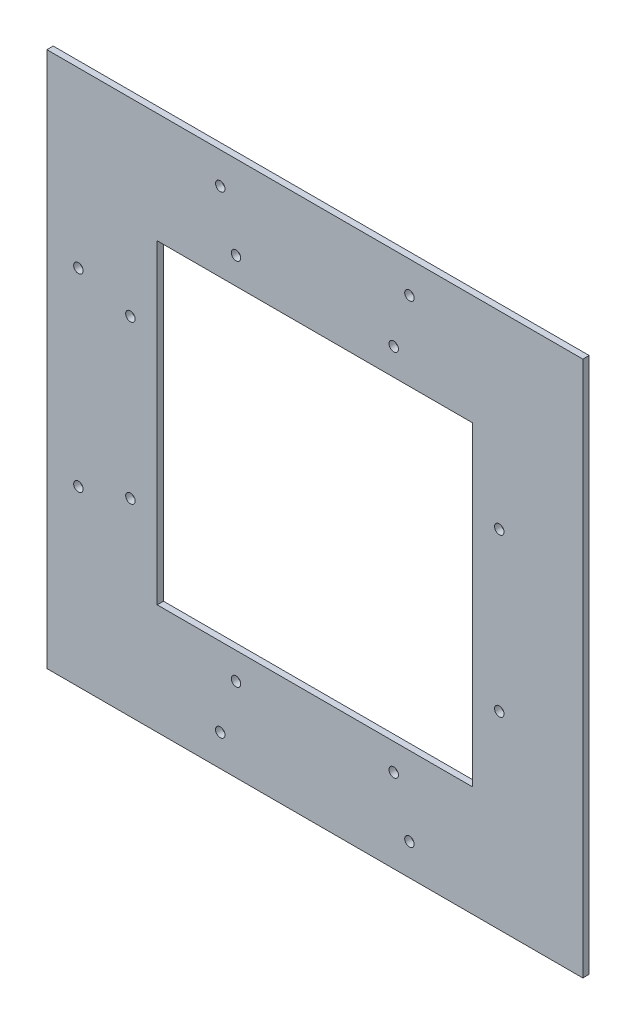
ISO-10303-21;
HEADER;
FILE_DESCRIPTION(('STEP AP214'),'2;1');
FILE_NAME('part.step','',(''),(''),'','','');
FILE_SCHEMA(('AUTOMOTIVE_DESIGN { 1 0 10303 214 1 1 1 1 }'));
ENDSEC;
DATA;
#1=APPLICATION_CONTEXT('core data for automotive mechanical design processes');
#2=APPLICATION_PROTOCOL_DEFINITION('international standard','automotive_design',2000,#1);
#3=PRODUCT_CONTEXT('',#1,'mechanical');
#4=PRODUCT('Part','Part','',(#3));
#5=PRODUCT_RELATED_PRODUCT_CATEGORY('part','',(#4));
#6=PRODUCT_DEFINITION_FORMATION('','',#4);
#7=PRODUCT_DEFINITION_CONTEXT('part definition',#1,'design');
#8=PRODUCT_DEFINITION('design','',#6,#7);
#9=PRODUCT_DEFINITION_SHAPE('','',#8);
#10=(LENGTH_UNIT() NAMED_UNIT(*) SI_UNIT(.MILLI.,.METRE.));
#11=(NAMED_UNIT(*) PLANE_ANGLE_UNIT() SI_UNIT($,.RADIAN.));
#12=(NAMED_UNIT(*) SI_UNIT($,.STERADIAN.) SOLID_ANGLE_UNIT());
#13=UNCERTAINTY_MEASURE_WITH_UNIT(LENGTH_MEASURE(1.E-05),#10,'distance_accuracy_value','');
#14=(GEOMETRIC_REPRESENTATION_CONTEXT(3) GLOBAL_UNCERTAINTY_ASSIGNED_CONTEXT((#13)) GLOBAL_UNIT_ASSIGNED_CONTEXT((#10,
#11,#12)) REPRESENTATION_CONTEXT('',''));
#15=CARTESIAN_POINT('',(0.,0.,0.));
#16=DIRECTION('',(0.,0.,1.));
#17=DIRECTION('',(1.,0.,0.));
#18=AXIS2_PLACEMENT_3D('',#15,#16,#17);
#19=CARTESIAN_POINT('',(85.,85.,2.));
#20=DIRECTION('',(0.,0.,-1.));
#21=DIRECTION('',(-1.,0.,0.));
#22=AXIS2_PLACEMENT_3D('',#19,#20,#21);
#23=PLANE('',#22);
#24=CARTESIAN_POINT('',(30.,75.,2.));
#25=DIRECTION('',(0.,0.,1.));
#26=DIRECTION('',(1.,0.,0.));
#27=AXIS2_PLACEMENT_3D('',#24,#25,#26);
#28=CIRCLE('',#27,1.5);
#29=CARTESIAN_POINT('',(31.5,75.,2.));
#30=VERTEX_POINT('',#29);
#31=EDGE_CURVE('E568',#30,#30,#28,.T.);
#32=ORIENTED_EDGE('',*,*,#31,.F.);
#33=EDGE_LOOP('',(#32));
#34=FACE_BOUND('',#33,.T.);
#35=CARTESIAN_POINT('',(-30.,75.,2.));
#36=DIRECTION('',(0.,0.,1.));
#37=DIRECTION('',(1.,0.,0.));
#38=AXIS2_PLACEMENT_3D('',#35,#36,#37);
#39=CIRCLE('',#38,1.5);
#40=CARTESIAN_POINT('',(-28.5,75.,2.));
#41=VERTEX_POINT('',#40);
#42=EDGE_CURVE('E519',#41,#41,#39,.T.);
#43=ORIENTED_EDGE('',*,*,#42,.F.);
#44=EDGE_LOOP('',(#43));
#45=FACE_BOUND('',#44,.T.);
#46=CARTESIAN_POINT('',(-25.,-58.5,2.));
#47=DIRECTION('',(0.,0.,-1.));
#48=DIRECTION('',(1.,0.,0.));
#49=AXIS2_PLACEMENT_3D('',#46,#47,#48);
#50=CIRCLE('',#49,1.5);
#51=CARTESIAN_POINT('',(-23.5,-58.5,2.));
#52=VERTEX_POINT('',#51);
#53=EDGE_CURVE('E198',#52,#52,#50,.T.);
#54=ORIENTED_EDGE('',*,*,#53,.T.);
#55=EDGE_LOOP('',(#54));
#56=FACE_BOUND('',#55,.T.);
#57=CARTESIAN_POINT('',(25.,58.5,2.));
#58=DIRECTION('',(0.,0.,1.));
#59=DIRECTION('',(1.,0.,0.));
#60=AXIS2_PLACEMENT_3D('',#57,#58,#59);
#61=CIRCLE('',#60,1.5);
#62=CARTESIAN_POINT('',(26.5,58.5,2.));
#63=VERTEX_POINT('',#62);
#64=EDGE_CURVE('E194',#63,#63,#61,.T.);
#65=ORIENTED_EDGE('',*,*,#64,.F.);
#66=EDGE_LOOP('',(#65));
#67=FACE_BOUND('',#66,.T.);
#68=CARTESIAN_POINT('',(-25.,58.5,2.));
#69=DIRECTION('',(0.,0.,1.));
#70=DIRECTION('',(1.,0.,0.));
#71=AXIS2_PLACEMENT_3D('',#68,#69,#70);
#72=CIRCLE('',#71,1.5);
#73=CARTESIAN_POINT('',(-23.5,58.5,2.));
#74=VERTEX_POINT('',#73);
#75=EDGE_CURVE('E190',#74,#74,#72,.T.);
#76=ORIENTED_EDGE('',*,*,#75,.F.);
#77=EDGE_LOOP('',(#76));
#78=FACE_BOUND('',#77,.T.);
#79=CARTESIAN_POINT('',(58.5,-25.,2.));
#80=DIRECTION('',(0.,0.,-1.));
#81=DIRECTION('',(-1.,0.,0.));
#82=AXIS2_PLACEMENT_3D('',#79,#80,#81);
#83=CIRCLE('',#82,1.5);
#84=CARTESIAN_POINT('',(57.,-25.,2.));
#85=VERTEX_POINT('',#84);
#86=EDGE_CURVE('E182',#85,#85,#83,.T.);
#87=ORIENTED_EDGE('',*,*,#86,.T.);
#88=EDGE_LOOP('',(#87));
#89=FACE_BOUND('',#88,.T.);
#90=CARTESIAN_POINT('',(-58.5,25.,2.));
#91=DIRECTION('',(0.,0.,1.));
#92=DIRECTION('',(1.,0.,0.));
#93=AXIS2_PLACEMENT_3D('',#90,#91,#92);
#94=CIRCLE('',#93,1.5);
#95=CARTESIAN_POINT('',(-57.,25.,2.));
#96=VERTEX_POINT('',#95);
#97=EDGE_CURVE('E178',#96,#96,#94,.T.);
#98=ORIENTED_EDGE('',*,*,#97,.F.);
#99=EDGE_LOOP('',(#98));
#100=FACE_BOUND('',#99,.T.);
#101=CARTESIAN_POINT('',(-58.5,-25.,2.));
#102=DIRECTION('',(0.,0.,1.));
#103=DIRECTION('',(1.,0.,0.));
#104=AXIS2_PLACEMENT_3D('',#101,#102,#103);
#105=CIRCLE('',#104,1.5);
#106=CARTESIAN_POINT('',(-57.,-25.,2.));
#107=VERTEX_POINT('',#106);
#108=EDGE_CURVE('E174',#107,#107,#105,.T.);
#109=ORIENTED_EDGE('',*,*,#108,.F.);
#110=EDGE_LOOP('',(#109));
#111=FACE_BOUND('',#110,.T.);
#112=CARTESIAN_POINT('',(-75.,30.,2.));
#113=DIRECTION('',(0.,0.,1.));
#114=DIRECTION('',(1.,0.,0.));
#115=AXIS2_PLACEMENT_3D('',#112,#113,#114);
#116=CIRCLE('',#115,1.5);
#117=CARTESIAN_POINT('',(-73.5,30.,2.));
#118=VERTEX_POINT('',#117);
#119=EDGE_CURVE('E170',#118,#118,#116,.T.);
#120=ORIENTED_EDGE('',*,*,#119,.F.);
#121=EDGE_LOOP('',(#120));
#122=FACE_BOUND('',#121,.T.);
#123=CARTESIAN_POINT('',(-75.,-30.,2.));
#124=DIRECTION('',(0.,0.,1.));
#125=DIRECTION('',(1.,0.,0.));
#126=AXIS2_PLACEMENT_3D('',#123,#124,#125);
#127=CIRCLE('',#126,1.5);
#128=CARTESIAN_POINT('',(-73.5,-30.,2.));
#129=VERTEX_POINT('',#128);
#130=EDGE_CURVE('E166',#129,#129,#127,.T.);
#131=ORIENTED_EDGE('',*,*,#130,.F.);
#132=EDGE_LOOP('',(#131));
#133=FACE_BOUND('',#132,.T.);
#134=DIRECTION('',(-1.,0.,0.));
#135=VECTOR('',#134,1.);
#136=CARTESIAN_POINT('',(-50.,50.,2.));
#137=LINE('',#136,#135);
#138=CARTESIAN_POINT('',(50.,50.,2.));
#139=VERTEX_POINT('',#138);
#140=CARTESIAN_POINT('',(-50.,50.,2.));
#141=VERTEX_POINT('',#140);
#142=EDGE_CURVE('E110',#139,#141,#137,.T.);
#143=ORIENTED_EDGE('',*,*,#142,.F.);
#144=DIRECTION('',(0.,1.,0.));
#145=VECTOR('',#144,1.);
#146=CARTESIAN_POINT('',(50.,-50.,2.));
#147=LINE('',#146,#145);
#148=CARTESIAN_POINT('',(50.,-50.,2.));
#149=VERTEX_POINT('',#148);
#150=EDGE_CURVE('E48',#149,#139,#147,.T.);
#151=ORIENTED_EDGE('',*,*,#150,.F.);
#152=DIRECTION('',(1.,0.,0.));
#153=VECTOR('',#152,1.);
#154=CARTESIAN_POINT('',(-50.,-50.,2.));
#155=LINE('',#154,#153);
#156=CARTESIAN_POINT('',(-50.,-50.,2.));
#157=VERTEX_POINT('',#156);
#158=EDGE_CURVE('E116',#157,#149,#155,.T.);
#159=ORIENTED_EDGE('',*,*,#158,.F.);
#160=DIRECTION('',(0.,-1.,0.));
#161=VECTOR('',#160,1.);
#162=CARTESIAN_POINT('',(-50.,-50.,2.));
#163=LINE('',#162,#161);
#164=EDGE_CURVE('E101',#141,#157,#163,.T.);
#165=ORIENTED_EDGE('',*,*,#164,.F.);
#166=EDGE_LOOP('',(#143,#151,#159,#165));
#167=FACE_BOUND('',#166,.T.);
#168=DIRECTION('',(0.,1.,0.));
#169=VECTOR('',#168,1.);
#170=CARTESIAN_POINT('',(85.,-85.,2.));
#171=LINE('',#170,#169);
#172=CARTESIAN_POINT('',(85.,-85.,2.));
#173=VERTEX_POINT('',#172);
#174=CARTESIAN_POINT('',(85.,85.,2.));
#175=VERTEX_POINT('',#174);
#176=EDGE_CURVE('E126',#173,#175,#171,.T.);
#177=ORIENTED_EDGE('',*,*,#176,.T.);
#178=DIRECTION('',(-1.,0.,0.));
#179=VECTOR('',#178,1.);
#180=CARTESIAN_POINT('',(-85.,85.,2.));
#181=LINE('',#180,#179);
#182=CARTESIAN_POINT('',(-85.,85.,2.));
#183=VERTEX_POINT('',#182);
#184=EDGE_CURVE('E129',#175,#183,#181,.T.);
#185=ORIENTED_EDGE('',*,*,#184,.T.);
#186=DIRECTION('',(0.,-1.,0.));
#187=VECTOR('',#186,1.);
#188=CARTESIAN_POINT('',(-85.,-85.,2.));
#189=LINE('',#188,#187);
#190=CARTESIAN_POINT('',(-85.,-85.,2.));
#191=VERTEX_POINT('',#190);
#192=EDGE_CURVE('E132',#183,#191,#189,.T.);
#193=ORIENTED_EDGE('',*,*,#192,.T.);
#194=DIRECTION('',(1.,0.,0.));
#195=VECTOR('',#194,1.);
#196=CARTESIAN_POINT('',(-85.,-85.,2.));
#197=LINE('',#196,#195);
#198=EDGE_CURVE('E134',#191,#173,#197,.T.);
#199=ORIENTED_EDGE('',*,*,#198,.T.);
#200=EDGE_LOOP('',(#177,#185,#193,#199));
#201=FACE_BOUND('',#200,.T.);
#202=CARTESIAN_POINT('',(58.5,25.,2.));
#203=DIRECTION('',(0.,0.,-1.));
#204=DIRECTION('',(-1.,0.,0.));
#205=AXIS2_PLACEMENT_3D('',#202,#203,#204);
#206=CIRCLE('',#205,1.5);
#207=CARTESIAN_POINT('',(57.,25.,2.));
#208=VERTEX_POINT('',#207);
#209=EDGE_CURVE('E186',#208,#208,#206,.T.);
#210=ORIENTED_EDGE('',*,*,#209,.T.);
#211=EDGE_LOOP('',(#210));
#212=FACE_BOUND('',#211,.T.);
#213=CARTESIAN_POINT('',(25.,-58.5,2.));
#214=DIRECTION('',(0.,0.,-1.));
#215=DIRECTION('',(1.,0.,0.));
#216=AXIS2_PLACEMENT_3D('',#213,#214,#215);
#217=CIRCLE('',#216,1.5);
#218=CARTESIAN_POINT('',(26.5,-58.5,2.));
#219=VERTEX_POINT('',#218);
#220=EDGE_CURVE('E202',#219,#219,#217,.T.);
#221=ORIENTED_EDGE('',*,*,#220,.T.);
#222=EDGE_LOOP('',(#221));
#223=FACE_BOUND('',#222,.T.);
#224=CARTESIAN_POINT('',(-30.,-75.,2.));
#225=DIRECTION('',(0.,0.,1.));
#226=DIRECTION('',(1.,0.,0.));
#227=AXIS2_PLACEMENT_3D('',#224,#225,#226);
#228=CIRCLE('',#227,1.5);
#229=CARTESIAN_POINT('',(-28.5,-75.,2.));
#230=VERTEX_POINT('',#229);
#231=EDGE_CURVE('E205',#230,#230,#228,.T.);
#232=ORIENTED_EDGE('',*,*,#231,.F.);
#233=EDGE_LOOP('',(#232));
#234=FACE_BOUND('',#233,.T.);
#235=CARTESIAN_POINT('',(30.,-75.,2.));
#236=DIRECTION('',(0.,0.,1.));
#237=DIRECTION('',(1.,0.,0.));
#238=AXIS2_PLACEMENT_3D('',#235,#236,#237);
#239=CIRCLE('',#238,1.5);
#240=CARTESIAN_POINT('',(31.5,-75.,2.));
#241=VERTEX_POINT('',#240);
#242=EDGE_CURVE('E11',#241,#241,#239,.T.);
#243=ORIENTED_EDGE('',*,*,#242,.F.);
#244=EDGE_LOOP('',(#243));
#245=FACE_BOUND('',#244,.T.);
#246=ADVANCED_FACE('F33',(#34,#45,#56,#67,#78,#89,#100,#111,#122,#133,#167,#201,#212,#223,#234,
#245),#23,.F.);
#247=CARTESIAN_POINT('',(85.,85.,0.));
#248=DIRECTION('',(0.,0.,-1.));
#249=DIRECTION('',(-1.,0.,0.));
#250=AXIS2_PLACEMENT_3D('',#247,#248,#249);
#251=PLANE('',#250);
#252=CARTESIAN_POINT('',(30.,75.,0.));
#253=DIRECTION('',(0.,0.,1.));
#254=DIRECTION('',(1.,0.,0.));
#255=AXIS2_PLACEMENT_3D('',#252,#253,#254);
#256=CIRCLE('',#255,1.5);
#257=CARTESIAN_POINT('',(31.5,75.,0.));
#258=VERTEX_POINT('',#257);
#259=EDGE_CURVE('E572',#258,#258,#256,.T.);
#260=ORIENTED_EDGE('',*,*,#259,.T.);
#261=EDGE_LOOP('',(#260));
#262=FACE_BOUND('',#261,.T.);
#263=CARTESIAN_POINT('',(-30.,75.,0.));
#264=DIRECTION('',(0.,0.,1.));
#265=DIRECTION('',(1.,0.,0.));
#266=AXIS2_PLACEMENT_3D('',#263,#264,#265);
#267=CIRCLE('',#266,1.5);
#268=CARTESIAN_POINT('',(-28.5,75.,0.));
#269=VERTEX_POINT('',#268);
#270=EDGE_CURVE('E516',#269,#269,#267,.T.);
#271=ORIENTED_EDGE('',*,*,#270,.T.);
#272=EDGE_LOOP('',(#271));
#273=FACE_BOUND('',#272,.T.);
#274=CARTESIAN_POINT('',(-25.,-58.5,0.));
#275=DIRECTION('',(0.,0.,-1.));
#276=DIRECTION('',(-1.,0.,0.));
#277=AXIS2_PLACEMENT_3D('',#274,#275,#276);
#278=CIRCLE('',#277,1.5);
#279=CARTESIAN_POINT('',(-26.5,-58.5,0.));
#280=VERTEX_POINT('',#279);
#281=EDGE_CURVE('E195',#280,#280,#278,.F.);
#282=ORIENTED_EDGE('',*,*,#281,.T.);
#283=EDGE_LOOP('',(#282));
#284=FACE_BOUND('',#283,.T.);
#285=CARTESIAN_POINT('',(25.,58.5,0.));
#286=DIRECTION('',(0.,0.,-1.));
#287=DIRECTION('',(-1.,0.,0.));
#288=AXIS2_PLACEMENT_3D('',#285,#286,#287);
#289=CIRCLE('',#288,1.5);
#290=CARTESIAN_POINT('',(23.5,58.5,0.));
#291=VERTEX_POINT('',#290);
#292=EDGE_CURVE('E191',#291,#291,#289,.T.);
#293=ORIENTED_EDGE('',*,*,#292,.F.);
#294=EDGE_LOOP('',(#293));
#295=FACE_BOUND('',#294,.T.);
#296=CARTESIAN_POINT('',(-25.,58.5,0.));
#297=DIRECTION('',(0.,0.,-1.));
#298=DIRECTION('',(-1.,0.,0.));
#299=AXIS2_PLACEMENT_3D('',#296,#297,#298);
#300=CIRCLE('',#299,1.5);
#301=CARTESIAN_POINT('',(-26.5,58.5,0.));
#302=VERTEX_POINT('',#301);
#303=EDGE_CURVE('E187',#302,#302,#300,.T.);
#304=ORIENTED_EDGE('',*,*,#303,.F.);
#305=EDGE_LOOP('',(#304));
#306=FACE_BOUND('',#305,.T.);
#307=CARTESIAN_POINT('',(58.5,-25.,0.));
#308=DIRECTION('',(0.,0.,-1.));
#309=DIRECTION('',(-1.,0.,0.));
#310=AXIS2_PLACEMENT_3D('',#307,#308,#309);
#311=CIRCLE('',#310,1.5);
#312=CARTESIAN_POINT('',(57.,-25.,0.));
#313=VERTEX_POINT('',#312);
#314=EDGE_CURVE('E179',#313,#313,#311,.F.);
#315=ORIENTED_EDGE('',*,*,#314,.T.);
#316=EDGE_LOOP('',(#315));
#317=FACE_BOUND('',#316,.T.);
#318=CARTESIAN_POINT('',(-58.5,25.,0.));
#319=DIRECTION('',(0.,0.,-1.));
#320=DIRECTION('',(-1.,0.,0.));
#321=AXIS2_PLACEMENT_3D('',#318,#319,#320);
#322=CIRCLE('',#321,1.5);
#323=CARTESIAN_POINT('',(-60.,25.,0.));
#324=VERTEX_POINT('',#323);
#325=EDGE_CURVE('E175',#324,#324,#322,.T.);
#326=ORIENTED_EDGE('',*,*,#325,.F.);
#327=EDGE_LOOP('',(#326));
#328=FACE_BOUND('',#327,.T.);
#329=CARTESIAN_POINT('',(-58.5,-25.,0.));
#330=DIRECTION('',(0.,0.,-1.));
#331=DIRECTION('',(-1.,0.,0.));
#332=AXIS2_PLACEMENT_3D('',#329,#330,#331);
#333=CIRCLE('',#332,1.5);
#334=CARTESIAN_POINT('',(-60.,-25.,0.));
#335=VERTEX_POINT('',#334);
#336=EDGE_CURVE('E171',#335,#335,#333,.T.);
#337=ORIENTED_EDGE('',*,*,#336,.F.);
#338=EDGE_LOOP('',(#337));
#339=FACE_BOUND('',#338,.T.);
#340=CARTESIAN_POINT('',(-75.,30.,0.));
#341=DIRECTION('',(0.,0.,-1.));
#342=DIRECTION('',(-1.,0.,0.));
#343=AXIS2_PLACEMENT_3D('',#340,#341,#342);
#344=CIRCLE('',#343,1.5);
#345=CARTESIAN_POINT('',(-76.5,30.,0.));
#346=VERTEX_POINT('',#345);
#347=EDGE_CURVE('E167',#346,#346,#344,.T.);
#348=ORIENTED_EDGE('',*,*,#347,.F.);
#349=EDGE_LOOP('',(#348));
#350=FACE_BOUND('',#349,.T.);
#351=CARTESIAN_POINT('',(-75.,-30.,0.));
#352=DIRECTION('',(0.,0.,-1.));
#353=DIRECTION('',(-1.,0.,0.));
#354=AXIS2_PLACEMENT_3D('',#351,#352,#353);
#355=CIRCLE('',#354,1.5);
#356=CARTESIAN_POINT('',(-76.5,-30.,0.));
#357=VERTEX_POINT('',#356);
#358=EDGE_CURVE('E163',#357,#357,#355,.T.);
#359=ORIENTED_EDGE('',*,*,#358,.F.);
#360=EDGE_LOOP('',(#359));
#361=FACE_BOUND('',#360,.T.);
#362=DIRECTION('',(0.,-1.,0.));
#363=VECTOR('',#362,1.);
#364=CARTESIAN_POINT('',(50.,85.,0.));
#365=LINE('',#364,#363);
#366=CARTESIAN_POINT('',(50.,50.,0.));
#367=VERTEX_POINT('',#366);
#368=CARTESIAN_POINT('',(50.,-50.,0.));
#369=VERTEX_POINT('',#368);
#370=EDGE_CURVE('E160',#367,#369,#365,.T.);
#371=ORIENTED_EDGE('',*,*,#370,.F.);
#372=DIRECTION('',(1.,0.,0.));
#373=VECTOR('',#372,1.);
#374=CARTESIAN_POINT('',(85.,50.,0.));
#375=LINE('',#374,#373);
#376=CARTESIAN_POINT('',(-50.,50.,0.));
#377=VERTEX_POINT('',#376);
#378=EDGE_CURVE('E155',#377,#367,#375,.T.);
#379=ORIENTED_EDGE('',*,*,#378,.F.);
#380=DIRECTION('',(0.,1.,0.));
#381=VECTOR('',#380,1.);
#382=CARTESIAN_POINT('',(-50.,85.,0.));
#383=LINE('',#382,#381);
#384=CARTESIAN_POINT('',(-50.,-50.,0.));
#385=VERTEX_POINT('',#384);
#386=EDGE_CURVE('E104',#385,#377,#383,.T.);
#387=ORIENTED_EDGE('',*,*,#386,.F.);
#388=DIRECTION('',(-1.,0.,0.));
#389=VECTOR('',#388,1.);
#390=CARTESIAN_POINT('',(85.,-50.,0.));
#391=LINE('',#390,#389);
#392=EDGE_CURVE('E158',#369,#385,#391,.T.);
#393=ORIENTED_EDGE('',*,*,#392,.F.);
#394=EDGE_LOOP('',(#371,#379,#387,#393));
#395=FACE_BOUND('',#394,.T.);
#396=DIRECTION('',(0.,1.,0.));
#397=VECTOR('',#396,1.);
#398=CARTESIAN_POINT('',(85.,-85.,0.));
#399=LINE('',#398,#397);
#400=CARTESIAN_POINT('',(85.,-85.,0.));
#401=VERTEX_POINT('',#400);
#402=CARTESIAN_POINT('',(85.,85.,0.));
#403=VERTEX_POINT('',#402);
#404=EDGE_CURVE('E123',#401,#403,#399,.T.);
#405=ORIENTED_EDGE('',*,*,#404,.F.);
#406=DIRECTION('',(1.,0.,0.));
#407=VECTOR('',#406,1.);
#408=CARTESIAN_POINT('',(-85.,-85.,0.));
#409=LINE('',#408,#407);
#410=CARTESIAN_POINT('',(-85.,-85.,0.));
#411=VERTEX_POINT('',#410);
#412=EDGE_CURVE('E130',#411,#401,#409,.T.);
#413=ORIENTED_EDGE('',*,*,#412,.F.);
#414=DIRECTION('',(0.,-1.,0.));
#415=VECTOR('',#414,1.);
#416=CARTESIAN_POINT('',(-85.,-85.,0.));
#417=LINE('',#416,#415);
#418=CARTESIAN_POINT('',(-85.,85.,0.));
#419=VERTEX_POINT('',#418);
#420=EDGE_CURVE('E141',#419,#411,#417,.T.);
#421=ORIENTED_EDGE('',*,*,#420,.F.);
#422=DIRECTION('',(-1.,0.,0.));
#423=VECTOR('',#422,1.);
#424=CARTESIAN_POINT('',(-85.,85.,0.));
#425=LINE('',#424,#423);
#426=EDGE_CURVE('E139',#403,#419,#425,.T.);
#427=ORIENTED_EDGE('',*,*,#426,.F.);
#428=EDGE_LOOP('',(#405,#413,#421,#427));
#429=FACE_BOUND('',#428,.T.);
#430=CARTESIAN_POINT('',(58.5,25.,0.));
#431=DIRECTION('',(0.,0.,-1.));
#432=DIRECTION('',(-1.,0.,0.));
#433=AXIS2_PLACEMENT_3D('',#430,#431,#432);
#434=CIRCLE('',#433,1.5);
#435=CARTESIAN_POINT('',(57.,25.,0.));
#436=VERTEX_POINT('',#435);
#437=EDGE_CURVE('E183',#436,#436,#434,.F.);
#438=ORIENTED_EDGE('',*,*,#437,.T.);
#439=EDGE_LOOP('',(#438));
#440=FACE_BOUND('',#439,.T.);
#441=CARTESIAN_POINT('',(25.,-58.5,0.));
#442=DIRECTION('',(0.,0.,-1.));
#443=DIRECTION('',(-1.,0.,0.));
#444=AXIS2_PLACEMENT_3D('',#441,#442,#443);
#445=CIRCLE('',#444,1.5);
#446=CARTESIAN_POINT('',(23.5,-58.5,0.));
#447=VERTEX_POINT('',#446);
#448=EDGE_CURVE('E199',#447,#447,#445,.F.);
#449=ORIENTED_EDGE('',*,*,#448,.T.);
#450=EDGE_LOOP('',(#449));
#451=FACE_BOUND('',#450,.T.);
#452=CARTESIAN_POINT('',(-30.,-75.,0.));
#453=DIRECTION('',(0.,0.,1.));
#454=DIRECTION('',(1.,0.,0.));
#455=AXIS2_PLACEMENT_3D('',#452,#453,#454);
#456=CIRCLE('',#455,1.5);
#457=CARTESIAN_POINT('',(-28.5,-75.,0.));
#458=VERTEX_POINT('',#457);
#459=EDGE_CURVE('E162',#458,#458,#456,.T.);
#460=ORIENTED_EDGE('',*,*,#459,.T.);
#461=EDGE_LOOP('',(#460));
#462=FACE_BOUND('',#461,.T.);
#463=CARTESIAN_POINT('',(30.,-75.,0.));
#464=DIRECTION('',(0.,0.,1.));
#465=DIRECTION('',(1.,0.,0.));
#466=AXIS2_PLACEMENT_3D('',#463,#464,#465);
#467=CIRCLE('',#466,1.5);
#468=CARTESIAN_POINT('',(31.5,-75.,0.));
#469=VERTEX_POINT('',#468);
#470=EDGE_CURVE('E41',#469,#469,#467,.T.);
#471=ORIENTED_EDGE('',*,*,#470,.T.);
#472=EDGE_LOOP('',(#471));
#473=FACE_BOUND('',#472,.T.);
#474=ADVANCED_FACE('F210',(#262,#273,#284,#295,#306,#317,#328,#339,#350,#361,#395,#429,#440,
#451,#462,#473),#251,.T.);
#475=CARTESIAN_POINT('',(85.,-85.,2.));
#476=DIRECTION('',(-1.,0.,0.));
#477=DIRECTION('',(0.,0.,1.));
#478=AXIS2_PLACEMENT_3D('',#475,#476,#477);
#479=PLANE('',#478);
#480=ORIENTED_EDGE('',*,*,#404,.T.);
#481=DIRECTION('',(0.,0.,-1.));
#482=VECTOR('',#481,1.);
#483=CARTESIAN_POINT('',(85.,85.,2.));
#484=LINE('',#483,#482);
#485=EDGE_CURVE('E152',#175,#403,#484,.T.);
#486=ORIENTED_EDGE('',*,*,#485,.F.);
#487=ORIENTED_EDGE('',*,*,#176,.F.);
#488=DIRECTION('',(0.,0.,-1.));
#489=VECTOR('',#488,1.);
#490=CARTESIAN_POINT('',(85.,-85.,2.));
#491=LINE('',#490,#489);
#492=EDGE_CURVE('E136',#173,#401,#491,.T.);
#493=ORIENTED_EDGE('',*,*,#492,.T.);
#494=EDGE_LOOP('',(#480,#486,#487,#493));
#495=FACE_BOUND('',#494,.T.);
#496=ADVANCED_FACE('F223',(#495),#479,.F.);
#497=CARTESIAN_POINT('',(-85.,85.,2.));
#498=DIRECTION('',(0.,-1.,0.));
#499=DIRECTION('',(0.,0.,-1.));
#500=AXIS2_PLACEMENT_3D('',#497,#498,#499);
#501=PLANE('',#500);
#502=ORIENTED_EDGE('',*,*,#426,.T.);
#503=DIRECTION('',(0.,0.,-1.));
#504=VECTOR('',#503,1.);
#505=CARTESIAN_POINT('',(-85.,85.,2.));
#506=LINE('',#505,#504);
#507=EDGE_CURVE('E149',#183,#419,#506,.T.);
#508=ORIENTED_EDGE('',*,*,#507,.F.);
#509=ORIENTED_EDGE('',*,*,#184,.F.);
#510=ORIENTED_EDGE('',*,*,#485,.T.);
#511=EDGE_LOOP('',(#502,#508,#509,#510));
#512=FACE_BOUND('',#511,.T.);
#513=ADVANCED_FACE('F239',(#512),#501,.F.);
#514=CARTESIAN_POINT('',(-85.,-85.,2.));
#515=DIRECTION('',(1.,0.,0.));
#516=DIRECTION('',(0.,0.,-1.));
#517=AXIS2_PLACEMENT_3D('',#514,#515,#516);
#518=PLANE('',#517);
#519=ORIENTED_EDGE('',*,*,#420,.T.);
#520=DIRECTION('',(0.,0.,-1.));
#521=VECTOR('',#520,1.);
#522=CARTESIAN_POINT('',(-85.,-85.,2.));
#523=LINE('',#522,#521);
#524=EDGE_CURVE('E146',#191,#411,#523,.T.);
#525=ORIENTED_EDGE('',*,*,#524,.F.);
#526=ORIENTED_EDGE('',*,*,#192,.F.);
#527=ORIENTED_EDGE('',*,*,#507,.T.);
#528=EDGE_LOOP('',(#519,#525,#526,#527));
#529=FACE_BOUND('',#528,.T.);
#530=ADVANCED_FACE('F235',(#529),#518,.F.);
#531=CARTESIAN_POINT('',(-85.,-85.,2.));
#532=DIRECTION('',(0.,1.,0.));
#533=DIRECTION('',(0.,0.,1.));
#534=AXIS2_PLACEMENT_3D('',#531,#532,#533);
#535=PLANE('',#534);
#536=ORIENTED_EDGE('',*,*,#412,.T.);
#537=ORIENTED_EDGE('',*,*,#492,.F.);
#538=ORIENTED_EDGE('',*,*,#198,.F.);
#539=ORIENTED_EDGE('',*,*,#524,.T.);
#540=EDGE_LOOP('',(#536,#537,#538,#539));
#541=FACE_BOUND('',#540,.T.);
#542=ADVANCED_FACE('F232',(#541),#535,.F.);
#543=CARTESIAN_POINT('',(50.,-50.,-8.));
#544=DIRECTION('',(1.,0.,0.));
#545=DIRECTION('',(0.,0.,-1.));
#546=AXIS2_PLACEMENT_3D('',#543,#544,#545);
#547=PLANE('',#546);
#548=ORIENTED_EDGE('',*,*,#370,.T.);
#549=DIRECTION('',(0.,0.,1.));
#550=VECTOR('',#549,1.);
#551=CARTESIAN_POINT('',(50.,-50.,-8.));
#552=LINE('',#551,#550);
#553=EDGE_CURVE('E121',#369,#149,#552,.T.);
#554=ORIENTED_EDGE('',*,*,#553,.T.);
#555=ORIENTED_EDGE('',*,*,#150,.T.);
#556=DIRECTION('',(0.,0.,1.));
#557=VECTOR('',#556,1.);
#558=CARTESIAN_POINT('',(50.,50.,-8.));
#559=LINE('',#558,#557);
#560=EDGE_CURVE('E107',#367,#139,#559,.T.);
#561=ORIENTED_EDGE('',*,*,#560,.F.);
#562=EDGE_LOOP('',(#548,#554,#555,#561));
#563=FACE_BOUND('',#562,.T.);
#564=ADVANCED_FACE('F229',(#563),#547,.F.);
#565=CARTESIAN_POINT('',(-50.,-50.,-8.));
#566=DIRECTION('',(0.,-1.,0.));
#567=DIRECTION('',(0.,0.,-1.));
#568=AXIS2_PLACEMENT_3D('',#565,#566,#567);
#569=PLANE('',#568);
#570=ORIENTED_EDGE('',*,*,#392,.T.);
#571=DIRECTION('',(0.,0.,1.));
#572=VECTOR('',#571,1.);
#573=CARTESIAN_POINT('',(-50.,-50.,-8.));
#574=LINE('',#573,#572);
#575=EDGE_CURVE('E106',#385,#157,#574,.T.);
#576=ORIENTED_EDGE('',*,*,#575,.T.);
#577=ORIENTED_EDGE('',*,*,#158,.T.);
#578=ORIENTED_EDGE('',*,*,#553,.F.);
#579=EDGE_LOOP('',(#570,#576,#577,#578));
#580=FACE_BOUND('',#579,.T.);
#581=ADVANCED_FACE('F308',(#580),#569,.F.);
#582=CARTESIAN_POINT('',(-50.,-50.,-8.));
#583=DIRECTION('',(-1.,0.,0.));
#584=DIRECTION('',(0.,0.,1.));
#585=AXIS2_PLACEMENT_3D('',#582,#583,#584);
#586=PLANE('',#585);
#587=ORIENTED_EDGE('',*,*,#386,.T.);
#588=DIRECTION('',(0.,0.,1.));
#589=VECTOR('',#588,1.);
#590=CARTESIAN_POINT('',(-50.,50.,-8.));
#591=LINE('',#590,#589);
#592=EDGE_CURVE('E56',#377,#141,#591,.T.);
#593=ORIENTED_EDGE('',*,*,#592,.T.);
#594=ORIENTED_EDGE('',*,*,#164,.T.);
#595=ORIENTED_EDGE('',*,*,#575,.F.);
#596=EDGE_LOOP('',(#587,#593,#594,#595));
#597=FACE_BOUND('',#596,.T.);
#598=ADVANCED_FACE('F98',(#597),#586,.F.);
#599=CARTESIAN_POINT('',(-50.,50.,-8.));
#600=DIRECTION('',(0.,1.,0.));
#601=DIRECTION('',(0.,0.,1.));
#602=AXIS2_PLACEMENT_3D('',#599,#600,#601);
#603=PLANE('',#602);
#604=ORIENTED_EDGE('',*,*,#378,.T.);
#605=ORIENTED_EDGE('',*,*,#560,.T.);
#606=ORIENTED_EDGE('',*,*,#142,.T.);
#607=ORIENTED_EDGE('',*,*,#592,.F.);
#608=EDGE_LOOP('',(#604,#605,#606,#607));
#609=FACE_BOUND('',#608,.T.);
#610=ADVANCED_FACE('F111',(#609),#603,.F.);
#611=CARTESIAN_POINT('',(-75.,-30.,-118.));
#612=DIRECTION('',(0.,0.,1.));
#613=DIRECTION('',(1.,0.,0.));
#614=AXIS2_PLACEMENT_3D('',#611,#612,#613);
#615=CYLINDRICAL_SURFACE('',#614,1.5);
#616=ORIENTED_EDGE('',*,*,#358,.T.);
#617=EDGE_LOOP('',(#616));
#618=FACE_BOUND('',#617,.T.);
#619=ORIENTED_EDGE('',*,*,#130,.T.);
#620=EDGE_LOOP('',(#619));
#621=FACE_BOUND('',#620,.T.);
#622=ADVANCED_FACE('F303',(#618,#621),#615,.F.);
#623=CARTESIAN_POINT('',(-75.,30.,-118.));
#624=DIRECTION('',(0.,0.,1.));
#625=DIRECTION('',(1.,0.,0.));
#626=AXIS2_PLACEMENT_3D('',#623,#624,#625);
#627=CYLINDRICAL_SURFACE('',#626,1.5);
#628=ORIENTED_EDGE('',*,*,#347,.T.);
#629=EDGE_LOOP('',(#628));
#630=FACE_BOUND('',#629,.T.);
#631=ORIENTED_EDGE('',*,*,#119,.T.);
#632=EDGE_LOOP('',(#631));
#633=FACE_BOUND('',#632,.T.);
#634=ADVANCED_FACE('F299',(#630,#633),#627,.F.);
#635=CARTESIAN_POINT('',(-58.5,-25.,-118.));
#636=DIRECTION('',(0.,0.,1.));
#637=DIRECTION('',(1.,0.,0.));
#638=AXIS2_PLACEMENT_3D('',#635,#636,#637);
#639=CYLINDRICAL_SURFACE('',#638,1.5);
#640=ORIENTED_EDGE('',*,*,#336,.T.);
#641=EDGE_LOOP('',(#640));
#642=FACE_BOUND('',#641,.T.);
#643=ORIENTED_EDGE('',*,*,#108,.T.);
#644=EDGE_LOOP('',(#643));
#645=FACE_BOUND('',#644,.T.);
#646=ADVANCED_FACE('F295',(#642,#645),#639,.F.);
#647=CARTESIAN_POINT('',(-58.5,25.,-118.));
#648=DIRECTION('',(0.,0.,1.));
#649=DIRECTION('',(1.,0.,0.));
#650=AXIS2_PLACEMENT_3D('',#647,#648,#649);
#651=CYLINDRICAL_SURFACE('',#650,1.5);
#652=ORIENTED_EDGE('',*,*,#325,.T.);
#653=EDGE_LOOP('',(#652));
#654=FACE_BOUND('',#653,.T.);
#655=ORIENTED_EDGE('',*,*,#97,.T.);
#656=EDGE_LOOP('',(#655));
#657=FACE_BOUND('',#656,.T.);
#658=ADVANCED_FACE('F291',(#654,#657),#651,.F.);
#659=CARTESIAN_POINT('',(58.5,-25.,-118.));
#660=DIRECTION('',(0.,0.,1.));
#661=DIRECTION('',(1.,0.,0.));
#662=AXIS2_PLACEMENT_3D('',#659,#660,#661);
#663=CYLINDRICAL_SURFACE('',#662,1.5);
#664=ORIENTED_EDGE('',*,*,#314,.F.);
#665=EDGE_LOOP('',(#664));
#666=FACE_BOUND('',#665,.T.);
#667=ORIENTED_EDGE('',*,*,#86,.F.);
#668=EDGE_LOOP('',(#667));
#669=FACE_BOUND('',#668,.T.);
#670=ADVANCED_FACE('F287',(#666,#669),#663,.F.);
#671=CARTESIAN_POINT('',(58.5,25.,-118.));
#672=DIRECTION('',(0.,0.,1.));
#673=DIRECTION('',(1.,0.,0.));
#674=AXIS2_PLACEMENT_3D('',#671,#672,#673);
#675=CYLINDRICAL_SURFACE('',#674,1.5);
#676=ORIENTED_EDGE('',*,*,#437,.F.);
#677=EDGE_LOOP('',(#676));
#678=FACE_BOUND('',#677,.T.);
#679=ORIENTED_EDGE('',*,*,#209,.F.);
#680=EDGE_LOOP('',(#679));
#681=FACE_BOUND('',#680,.T.);
#682=ADVANCED_FACE('F283',(#678,#681),#675,.F.);
#683=CARTESIAN_POINT('',(-25.,58.5,-118.));
#684=DIRECTION('',(0.,0.,1.));
#685=DIRECTION('',(1.,0.,0.));
#686=AXIS2_PLACEMENT_3D('',#683,#684,#685);
#687=CYLINDRICAL_SURFACE('',#686,1.5);
#688=ORIENTED_EDGE('',*,*,#303,.T.);
#689=EDGE_LOOP('',(#688));
#690=FACE_BOUND('',#689,.T.);
#691=ORIENTED_EDGE('',*,*,#75,.T.);
#692=EDGE_LOOP('',(#691));
#693=FACE_BOUND('',#692,.T.);
#694=ADVANCED_FACE('F279',(#690,#693),#687,.F.);
#695=CARTESIAN_POINT('',(25.,58.5,-118.));
#696=DIRECTION('',(0.,0.,1.));
#697=DIRECTION('',(1.,0.,0.));
#698=AXIS2_PLACEMENT_3D('',#695,#696,#697);
#699=CYLINDRICAL_SURFACE('',#698,1.5);
#700=ORIENTED_EDGE('',*,*,#292,.T.);
#701=EDGE_LOOP('',(#700));
#702=FACE_BOUND('',#701,.T.);
#703=ORIENTED_EDGE('',*,*,#64,.T.);
#704=EDGE_LOOP('',(#703));
#705=FACE_BOUND('',#704,.T.);
#706=ADVANCED_FACE('F275',(#702,#705),#699,.F.);
#707=CARTESIAN_POINT('',(-25.,-58.5,-118.));
#708=DIRECTION('',(0.,0.,1.));
#709=DIRECTION('',(1.,0.,0.));
#710=AXIS2_PLACEMENT_3D('',#707,#708,#709);
#711=CYLINDRICAL_SURFACE('',#710,1.5);
#712=ORIENTED_EDGE('',*,*,#281,.F.);
#713=EDGE_LOOP('',(#712));
#714=FACE_BOUND('',#713,.T.);
#715=ORIENTED_EDGE('',*,*,#53,.F.);
#716=EDGE_LOOP('',(#715));
#717=FACE_BOUND('',#716,.T.);
#718=ADVANCED_FACE('F271',(#714,#717),#711,.F.);
#719=CARTESIAN_POINT('',(25.,-58.5,-118.));
#720=DIRECTION('',(0.,0.,1.));
#721=DIRECTION('',(1.,0.,0.));
#722=AXIS2_PLACEMENT_3D('',#719,#720,#721);
#723=CYLINDRICAL_SURFACE('',#722,1.5);
#724=ORIENTED_EDGE('',*,*,#448,.F.);
#725=EDGE_LOOP('',(#724));
#726=FACE_BOUND('',#725,.T.);
#727=ORIENTED_EDGE('',*,*,#220,.F.);
#728=EDGE_LOOP('',(#727));
#729=FACE_BOUND('',#728,.T.);
#730=ADVANCED_FACE('F263',(#726,#729),#723,.F.);
#731=CARTESIAN_POINT('',(-30.,75.,0.));
#732=DIRECTION('',(0.,0.,1.));
#733=DIRECTION('',(1.,0.,0.));
#734=AXIS2_PLACEMENT_3D('',#731,#732,#733);
#735=CYLINDRICAL_SURFACE('',#734,1.5);
#736=ORIENTED_EDGE('',*,*,#270,.F.);
#737=EDGE_LOOP('',(#736));
#738=FACE_BOUND('',#737,.T.);
#739=ORIENTED_EDGE('',*,*,#42,.T.);
#740=EDGE_LOOP('',(#739));
#741=FACE_BOUND('',#740,.T.);
#742=ADVANCED_FACE('F252',(#738,#741),#735,.F.);
#743=CARTESIAN_POINT('',(30.,75.,0.));
#744=DIRECTION('',(0.,0.,1.));
#745=DIRECTION('',(1.,0.,0.));
#746=AXIS2_PLACEMENT_3D('',#743,#744,#745);
#747=CYLINDRICAL_SURFACE('',#746,1.5);
#748=ORIENTED_EDGE('',*,*,#259,.F.);
#749=EDGE_LOOP('',(#748));
#750=FACE_BOUND('',#749,.T.);
#751=ORIENTED_EDGE('',*,*,#31,.T.);
#752=EDGE_LOOP('',(#751));
#753=FACE_BOUND('',#752,.T.);
#754=ADVANCED_FACE('F247',(#750,#753),#747,.F.);
#755=CARTESIAN_POINT('',(-30.,-75.,0.));
#756=DIRECTION('',(0.,0.,1.));
#757=DIRECTION('',(1.,0.,0.));
#758=AXIS2_PLACEMENT_3D('',#755,#756,#757);
#759=CYLINDRICAL_SURFACE('',#758,1.5);
#760=ORIENTED_EDGE('',*,*,#459,.F.);
#761=EDGE_LOOP('',(#760));
#762=FACE_BOUND('',#761,.T.);
#763=ORIENTED_EDGE('',*,*,#231,.T.);
#764=EDGE_LOOP('',(#763));
#765=FACE_BOUND('',#764,.T.);
#766=ADVANCED_FACE('F214',(#762,#765),#759,.F.);
#767=CARTESIAN_POINT('',(30.,-75.,0.));
#768=DIRECTION('',(0.,0.,1.));
#769=DIRECTION('',(1.,0.,0.));
#770=AXIS2_PLACEMENT_3D('',#767,#768,#769);
#771=CYLINDRICAL_SURFACE('',#770,1.5);
#772=ORIENTED_EDGE('',*,*,#470,.F.);
#773=EDGE_LOOP('',(#772));
#774=FACE_BOUND('',#773,.T.);
#775=ORIENTED_EDGE('',*,*,#242,.T.);
#776=EDGE_LOOP('',(#775));
#777=FACE_BOUND('',#776,.T.);
#778=ADVANCED_FACE('F35',(#774,#777),#771,.F.);
#779=CLOSED_SHELL('',(#246,#474,#496,#513,#530,#542,#564,#581,#598,#610,#622,#634,#646,#658,
#670,#682,#694,#706,#718,#730,#742,#754,#766,#778));
#780=MANIFOLD_SOLID_BREP('B2',#779);
#781=ADVANCED_BREP_SHAPE_REPRESENTATION('',(#18,#780),#14);
#782=SHAPE_DEFINITION_REPRESENTATION(#9,#781);
ENDSEC;
END-ISO-10303-21;
